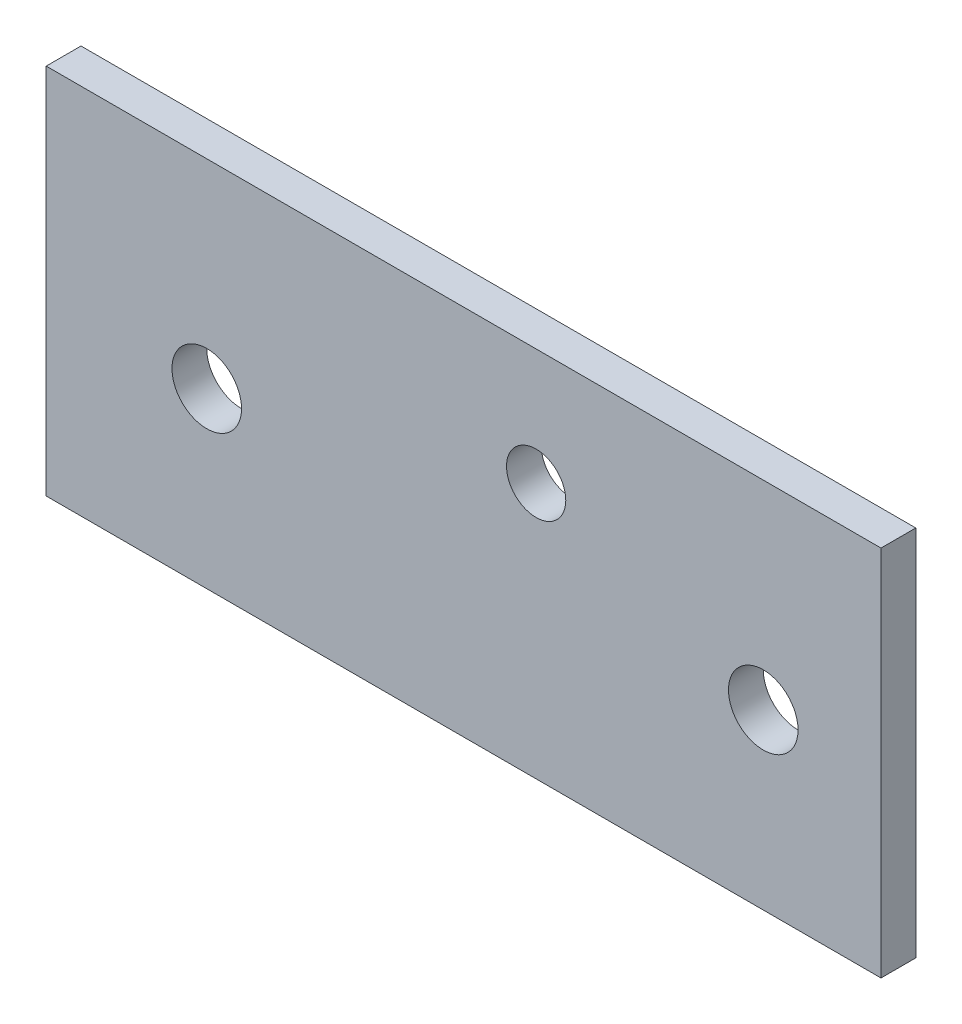
ISO-10303-21;
HEADER;
FILE_DESCRIPTION(('STEP AP214'),'2;1');
FILE_NAME('part.step','',(''),(''),'','','');
FILE_SCHEMA(('AUTOMOTIVE_DESIGN { 1 0 10303 214 1 1 1 1 }'));
ENDSEC;
DATA;
#1=APPLICATION_CONTEXT('core data for automotive mechanical design processes');
#2=APPLICATION_PROTOCOL_DEFINITION('international standard','automotive_design',2000,#1);
#3=PRODUCT_CONTEXT('',#1,'mechanical');
#4=PRODUCT('Part','Part','',(#3));
#5=PRODUCT_RELATED_PRODUCT_CATEGORY('part','',(#4));
#6=PRODUCT_DEFINITION_FORMATION('','',#4);
#7=PRODUCT_DEFINITION_CONTEXT('part definition',#1,'design');
#8=PRODUCT_DEFINITION('design','',#6,#7);
#9=PRODUCT_DEFINITION_SHAPE('','',#8);
#10=(LENGTH_UNIT() NAMED_UNIT(*) SI_UNIT(.MILLI.,.METRE.));
#11=(NAMED_UNIT(*) PLANE_ANGLE_UNIT() SI_UNIT($,.RADIAN.));
#12=(NAMED_UNIT(*) SI_UNIT($,.STERADIAN.) SOLID_ANGLE_UNIT());
#13=UNCERTAINTY_MEASURE_WITH_UNIT(LENGTH_MEASURE(1.E-05),#10,'distance_accuracy_value','');
#14=(GEOMETRIC_REPRESENTATION_CONTEXT(3) GLOBAL_UNCERTAINTY_ASSIGNED_CONTEXT((#13)) GLOBAL_UNIT_ASSIGNED_CONTEXT((#10,
#11,#12)) REPRESENTATION_CONTEXT('',''));
#15=CARTESIAN_POINT('',(0.,0.,0.));
#16=DIRECTION('',(0.,0.,1.));
#17=DIRECTION('',(1.,0.,0.));
#18=AXIS2_PLACEMENT_3D('',#15,#16,#17);
#19=CARTESIAN_POINT('',(0.,0.,3.175));
#20=DIRECTION('',(0.,0.,1.));
#21=DIRECTION('',(1.,0.,0.));
#22=AXIS2_PLACEMENT_3D('',#19,#20,#21);
#23=PLANE('',#22);
#24=CARTESIAN_POINT('',(55.4677218999957,-287.273383219133,3.175));
#25=DIRECTION('',(0.,0.,1.));
#26=DIRECTION('',(1.,0.,0.));
#27=AXIS2_PLACEMENT_3D('',#24,#25,#26);
#28=CIRCLE('',#27,2.70509999999999);
#29=CARTESIAN_POINT('',(58.1728218999956,-287.273383219133,3.175));
#30=VERTEX_POINT('',#29);
#31=EDGE_CURVE('E132',#30,#30,#28,.T.);
#32=ORIENTED_EDGE('',*,*,#31,.F.);
#33=EDGE_LOOP('',(#32));
#34=FACE_BOUND('',#33,.T.);
#35=CARTESIAN_POINT('',(25.400000000001,-294.821428571429,3.175));
#36=DIRECTION('',(0.,0.,1.));
#37=DIRECTION('',(1.,0.,0.));
#38=AXIS2_PLACEMENT_3D('',#35,#36,#37);
#39=CIRCLE('',#38,3.17499999999998);
#40=CARTESIAN_POINT('',(28.575000000001,-294.821428571429,3.175));
#41=VERTEX_POINT('',#40);
#42=EDGE_CURVE('E106',#41,#41,#39,.T.);
#43=ORIENTED_EDGE('',*,*,#42,.F.);
#44=EDGE_LOOP('',(#43));
#45=FACE_BOUND('',#44,.T.);
#46=DIRECTION('',(0.,-1.,0.));
#47=VECTOR('',#46,1.);
#48=CARTESIAN_POINT('',(10.7469949994454,-276.653414665958,3.175));
#49=LINE('',#48,#47);
#50=CARTESIAN_POINT('',(10.7469949994454,-276.653414665958,3.175));
#51=VERTEX_POINT('',#50);
#52=CARTESIAN_POINT('',(10.7469949994454,-310.642405628526,3.175));
#53=VERTEX_POINT('',#52);
#54=EDGE_CURVE('E91',#51,#53,#49,.T.);
#55=ORIENTED_EDGE('',*,*,#54,.T.);
#56=DIRECTION('',(1.,0.,0.));
#57=VECTOR('',#56,1.);
#58=CARTESIAN_POINT('',(10.7469949994454,-310.642405628526,3.175));
#59=LINE('',#58,#57);
#60=CARTESIAN_POINT('',(86.9469949994454,-310.642405628526,3.175));
#61=VERTEX_POINT('',#60);
#62=EDGE_CURVE('E86',#53,#61,#59,.T.);
#63=ORIENTED_EDGE('',*,*,#62,.T.);
#64=DIRECTION('',(0.,1.,0.));
#65=VECTOR('',#64,1.);
#66=CARTESIAN_POINT('',(86.9469949994454,-276.653414665958,3.175));
#67=LINE('',#66,#65);
#68=CARTESIAN_POINT('',(86.9469949994454,-276.653414665958,3.175));
#69=VERTEX_POINT('',#68);
#70=EDGE_CURVE('E89',#61,#69,#67,.T.);
#71=ORIENTED_EDGE('',*,*,#70,.T.);
#72=DIRECTION('',(-1.,0.,0.));
#73=VECTOR('',#72,1.);
#74=CARTESIAN_POINT('',(10.7469949994454,-276.653414665958,3.175));
#75=LINE('',#74,#73);
#76=EDGE_CURVE('E56',#69,#51,#75,.T.);
#77=ORIENTED_EDGE('',*,*,#76,.T.);
#78=EDGE_LOOP('',(#55,#63,#71,#77));
#79=FACE_BOUND('',#78,.T.);
#80=CARTESIAN_POINT('',(76.200000000001,-294.821428571428,3.175));
#81=DIRECTION('',(0.,0.,1.));
#82=DIRECTION('',(1.,0.,0.));
#83=AXIS2_PLACEMENT_3D('',#80,#81,#82);
#84=CIRCLE('',#83,3.175);
#85=CARTESIAN_POINT('',(79.375000000001,-294.821428571428,3.175));
#86=VERTEX_POINT('',#85);
#87=EDGE_CURVE('E121',#86,#86,#84,.T.);
#88=ORIENTED_EDGE('',*,*,#87,.F.);
#89=EDGE_LOOP('',(#88));
#90=FACE_BOUND('',#89,.T.);
#91=ADVANCED_FACE('F39',(#34,#45,#79,#90),#23,.T.);
#92=CARTESIAN_POINT('',(0.,0.,0.));
#93=DIRECTION('',(0.,0.,1.));
#94=DIRECTION('',(1.,0.,0.));
#95=AXIS2_PLACEMENT_3D('',#92,#93,#94);
#96=PLANE('',#95);
#97=CARTESIAN_POINT('',(55.4677218999957,-287.273383219133,0.));
#98=DIRECTION('',(0.,0.,1.));
#99=DIRECTION('',(1.,0.,0.));
#100=AXIS2_PLACEMENT_3D('',#97,#98,#99);
#101=CIRCLE('',#100,2.7051);
#102=CARTESIAN_POINT('',(58.1728218999957,-287.273383219133,0.));
#103=VERTEX_POINT('',#102);
#104=EDGE_CURVE('E127',#103,#103,#101,.T.);
#105=ORIENTED_EDGE('',*,*,#104,.T.);
#106=EDGE_LOOP('',(#105));
#107=FACE_BOUND('',#106,.T.);
#108=DIRECTION('',(0.,-1.,0.));
#109=VECTOR('',#108,1.);
#110=CARTESIAN_POINT('',(10.7469949994454,-276.653414665958,0.));
#111=LINE('',#110,#109);
#112=CARTESIAN_POINT('',(10.7469949994454,-276.653414665958,0.));
#113=VERTEX_POINT('',#112);
#114=CARTESIAN_POINT('',(10.7469949994454,-310.642405628526,0.));
#115=VERTEX_POINT('',#114);
#116=EDGE_CURVE('E103',#113,#115,#111,.T.);
#117=ORIENTED_EDGE('',*,*,#116,.F.);
#118=DIRECTION('',(-1.,0.,0.));
#119=VECTOR('',#118,1.);
#120=CARTESIAN_POINT('',(10.7469949994454,-276.653414665958,0.));
#121=LINE('',#120,#119);
#122=CARTESIAN_POINT('',(86.9469949994454,-276.653414665958,0.));
#123=VERTEX_POINT('',#122);
#124=EDGE_CURVE('E79',#123,#113,#121,.T.);
#125=ORIENTED_EDGE('',*,*,#124,.F.);
#126=DIRECTION('',(0.,1.,0.));
#127=VECTOR('',#126,1.);
#128=CARTESIAN_POINT('',(86.9469949994454,-276.653414665958,0.));
#129=LINE('',#128,#127);
#130=CARTESIAN_POINT('',(86.9469949994454,-310.642405628526,0.));
#131=VERTEX_POINT('',#130);
#132=EDGE_CURVE('E73',#131,#123,#129,.T.);
#133=ORIENTED_EDGE('',*,*,#132,.F.);
#134=DIRECTION('',(1.,0.,0.));
#135=VECTOR('',#134,1.);
#136=CARTESIAN_POINT('',(10.7469949994454,-310.642405628526,0.));
#137=LINE('',#136,#135);
#138=EDGE_CURVE('E95',#115,#131,#137,.T.);
#139=ORIENTED_EDGE('',*,*,#138,.F.);
#140=EDGE_LOOP('',(#117,#125,#133,#139));
#141=FACE_BOUND('',#140,.T.);
#142=CARTESIAN_POINT('',(25.400000000001,-294.821428571429,0.));
#143=DIRECTION('',(0.,0.,1.));
#144=DIRECTION('',(1.,0.,0.));
#145=AXIS2_PLACEMENT_3D('',#142,#143,#144);
#146=CIRCLE('',#145,3.17499999999998);
#147=CARTESIAN_POINT('',(28.575000000001,-294.821428571429,0.));
#148=VERTEX_POINT('',#147);
#149=EDGE_CURVE('E118',#148,#148,#146,.T.);
#150=ORIENTED_EDGE('',*,*,#149,.T.);
#151=EDGE_LOOP('',(#150));
#152=FACE_BOUND('',#151,.T.);
#153=CARTESIAN_POINT('',(76.200000000001,-294.821428571428,0.));
#154=DIRECTION('',(0.,0.,1.));
#155=DIRECTION('',(1.,0.,0.));
#156=AXIS2_PLACEMENT_3D('',#153,#154,#155);
#157=CIRCLE('',#156,3.175);
#158=CARTESIAN_POINT('',(79.375000000001,-294.821428571428,0.));
#159=VERTEX_POINT('',#158);
#160=EDGE_CURVE('E124',#159,#159,#157,.T.);
#161=ORIENTED_EDGE('',*,*,#160,.T.);
#162=EDGE_LOOP('',(#161));
#163=FACE_BOUND('',#162,.T.);
#164=ADVANCED_FACE('F114',(#107,#141,#152,#163),#96,.F.);
#165=CARTESIAN_POINT('',(10.7469949994454,-276.653414665958,3.175));
#166=DIRECTION('',(1.,0.,0.));
#167=DIRECTION('',(0.,0.,-1.));
#168=AXIS2_PLACEMENT_3D('',#165,#166,#167);
#169=PLANE('',#168);
#170=ORIENTED_EDGE('',*,*,#116,.T.);
#171=DIRECTION('',(0.,0.,-1.));
#172=VECTOR('',#171,1.);
#173=CARTESIAN_POINT('',(10.7469949994454,-310.642405628526,3.175));
#174=LINE('',#173,#172);
#175=EDGE_CURVE('E11',#53,#115,#174,.T.);
#176=ORIENTED_EDGE('',*,*,#175,.F.);
#177=ORIENTED_EDGE('',*,*,#54,.F.);
#178=DIRECTION('',(0.,0.,-1.));
#179=VECTOR('',#178,1.);
#180=CARTESIAN_POINT('',(10.7469949994454,-276.653414665958,3.175));
#181=LINE('',#180,#179);
#182=EDGE_CURVE('E99',#51,#113,#181,.T.);
#183=ORIENTED_EDGE('',*,*,#182,.T.);
#184=EDGE_LOOP('',(#170,#176,#177,#183));
#185=FACE_BOUND('',#184,.T.);
#186=ADVANCED_FACE('F41',(#185),#169,.F.);
#187=CARTESIAN_POINT('',(10.7469949994454,-310.642405628526,3.175));
#188=DIRECTION('',(0.,1.,0.));
#189=DIRECTION('',(0.,0.,1.));
#190=AXIS2_PLACEMENT_3D('',#187,#188,#189);
#191=PLANE('',#190);
#192=ORIENTED_EDGE('',*,*,#138,.T.);
#193=DIRECTION('',(0.,0.,-1.));
#194=VECTOR('',#193,1.);
#195=CARTESIAN_POINT('',(86.9469949994454,-310.642405628526,3.175));
#196=LINE('',#195,#194);
#197=EDGE_CURVE('E48',#61,#131,#196,.T.);
#198=ORIENTED_EDGE('',*,*,#197,.F.);
#199=ORIENTED_EDGE('',*,*,#62,.F.);
#200=ORIENTED_EDGE('',*,*,#175,.T.);
#201=EDGE_LOOP('',(#192,#198,#199,#200));
#202=FACE_BOUND('',#201,.T.);
#203=ADVANCED_FACE('F94',(#202),#191,.F.);
#204=CARTESIAN_POINT('',(86.9469949994454,-276.653414665958,3.175));
#205=DIRECTION('',(-1.,0.,0.));
#206=DIRECTION('',(0.,0.,1.));
#207=AXIS2_PLACEMENT_3D('',#204,#205,#206);
#208=PLANE('',#207);
#209=ORIENTED_EDGE('',*,*,#132,.T.);
#210=DIRECTION('',(0.,0.,-1.));
#211=VECTOR('',#210,1.);
#212=CARTESIAN_POINT('',(86.9469949994454,-276.653414665958,3.175));
#213=LINE('',#212,#211);
#214=EDGE_CURVE('E96',#69,#123,#213,.T.);
#215=ORIENTED_EDGE('',*,*,#214,.F.);
#216=ORIENTED_EDGE('',*,*,#70,.F.);
#217=ORIENTED_EDGE('',*,*,#197,.T.);
#218=EDGE_LOOP('',(#209,#215,#216,#217));
#219=FACE_BOUND('',#218,.T.);
#220=ADVANCED_FACE('F97',(#219),#208,.F.);
#221=CARTESIAN_POINT('',(10.7469949994454,-276.653414665958,3.175));
#222=DIRECTION('',(0.,-1.,0.));
#223=DIRECTION('',(0.,0.,-1.));
#224=AXIS2_PLACEMENT_3D('',#221,#222,#223);
#225=PLANE('',#224);
#226=ORIENTED_EDGE('',*,*,#124,.T.);
#227=ORIENTED_EDGE('',*,*,#182,.F.);
#228=ORIENTED_EDGE('',*,*,#76,.F.);
#229=ORIENTED_EDGE('',*,*,#214,.T.);
#230=EDGE_LOOP('',(#226,#227,#228,#229));
#231=FACE_BOUND('',#230,.T.);
#232=ADVANCED_FACE('F111',(#231),#225,.F.);
#233=CARTESIAN_POINT('',(25.400000000001,-294.821428571429,3.175));
#234=DIRECTION('',(0.,0.,-1.));
#235=DIRECTION('',(-1.,0.,0.));
#236=AXIS2_PLACEMENT_3D('',#233,#234,#235);
#237=CYLINDRICAL_SURFACE('',#236,3.17499999999998);
#238=ORIENTED_EDGE('',*,*,#42,.T.);
#239=EDGE_LOOP('',(#238));
#240=FACE_BOUND('',#239,.T.);
#241=ORIENTED_EDGE('',*,*,#149,.F.);
#242=EDGE_LOOP('',(#241));
#243=FACE_BOUND('',#242,.T.);
#244=ADVANCED_FACE('F143',(#240,#243),#237,.F.);
#245=CARTESIAN_POINT('',(76.200000000001,-294.821428571428,3.175));
#246=DIRECTION('',(0.,0.,-1.));
#247=DIRECTION('',(-1.,0.,0.));
#248=AXIS2_PLACEMENT_3D('',#245,#246,#247);
#249=CYLINDRICAL_SURFACE('',#248,3.175);
#250=ORIENTED_EDGE('',*,*,#87,.T.);
#251=EDGE_LOOP('',(#250));
#252=FACE_BOUND('',#251,.T.);
#253=ORIENTED_EDGE('',*,*,#160,.F.);
#254=EDGE_LOOP('',(#253));
#255=FACE_BOUND('',#254,.T.);
#256=ADVANCED_FACE('F146',(#252,#255),#249,.F.);
#257=CARTESIAN_POINT('',(55.4677218999957,-287.273383219133,3.175));
#258=DIRECTION('',(0.,0.,1.));
#259=DIRECTION('',(1.,0.,0.));
#260=AXIS2_PLACEMENT_3D('',#257,#258,#259);
#261=CYLINDRICAL_SURFACE('',#260,2.70509999999999);
#262=ORIENTED_EDGE('',*,*,#104,.F.);
#263=EDGE_LOOP('',(#262));
#264=FACE_BOUND('',#263,.T.);
#265=ORIENTED_EDGE('',*,*,#31,.T.);
#266=EDGE_LOOP('',(#265));
#267=FACE_BOUND('',#266,.T.);
#268=ADVANCED_FACE('F136',(#264,#267),#261,.F.);
#269=CLOSED_SHELL('',(#91,#164,#186,#203,#220,#232,#244,#256,#268));
#270=MANIFOLD_SOLID_BREP('B2',#269);
#271=ADVANCED_BREP_SHAPE_REPRESENTATION('',(#18,#270),#14);
#272=SHAPE_DEFINITION_REPRESENTATION(#9,#271);
ENDSEC;
END-ISO-10303-21;
